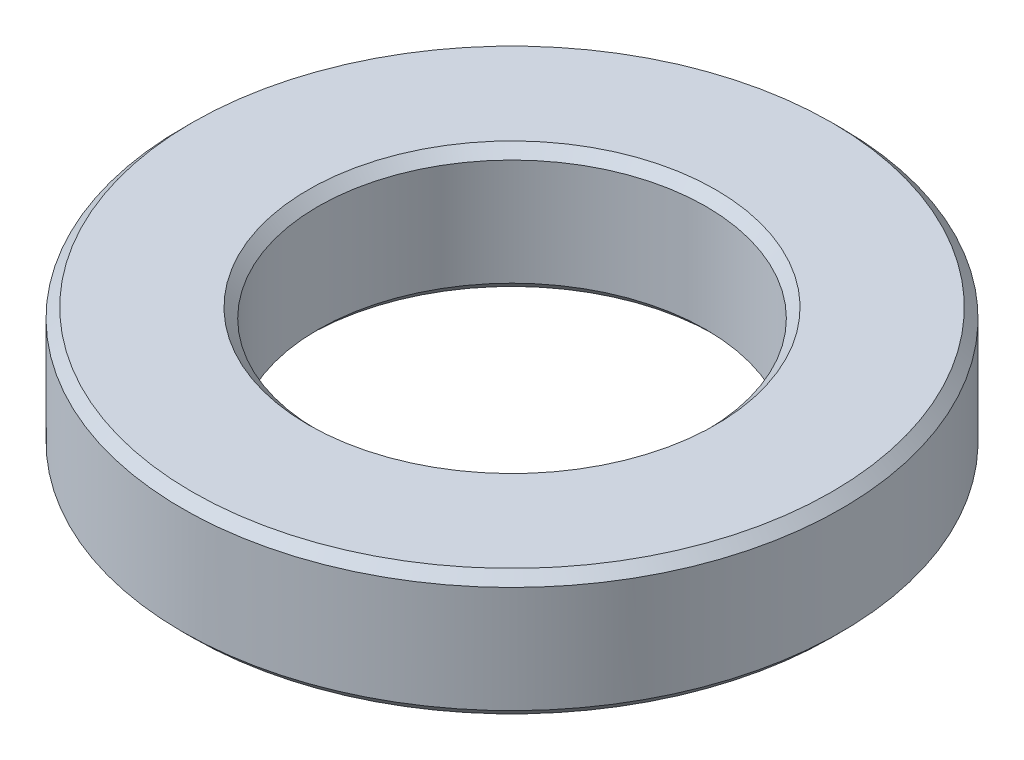
ISO-10303-21;
HEADER;
FILE_DESCRIPTION(('STEP AP214'),'2;1');
FILE_NAME('part.step','',(''),(''),'','','');
FILE_SCHEMA(('AUTOMOTIVE_DESIGN { 1 0 10303 214 1 1 1 1 }'));
ENDSEC;
DATA;
#1=APPLICATION_CONTEXT('core data for automotive mechanical design processes');
#2=APPLICATION_PROTOCOL_DEFINITION('international standard','automotive_design',2000,#1);
#3=PRODUCT_CONTEXT('',#1,'mechanical');
#4=PRODUCT('Part','Part','',(#3));
#5=PRODUCT_RELATED_PRODUCT_CATEGORY('part','',(#4));
#6=PRODUCT_DEFINITION_FORMATION('','',#4);
#7=PRODUCT_DEFINITION_CONTEXT('part definition',#1,'design');
#8=PRODUCT_DEFINITION('design','',#6,#7);
#9=PRODUCT_DEFINITION_SHAPE('','',#8);
#10=(LENGTH_UNIT() NAMED_UNIT(*) SI_UNIT(.MILLI.,.METRE.));
#11=(NAMED_UNIT(*) PLANE_ANGLE_UNIT() SI_UNIT($,.RADIAN.));
#12=(NAMED_UNIT(*) SI_UNIT($,.STERADIAN.) SOLID_ANGLE_UNIT());
#13=UNCERTAINTY_MEASURE_WITH_UNIT(LENGTH_MEASURE(1.E-05),#10,'distance_accuracy_value','');
#14=(GEOMETRIC_REPRESENTATION_CONTEXT(3) GLOBAL_UNCERTAINTY_ASSIGNED_CONTEXT((#13)) GLOBAL_UNIT_ASSIGNED_CONTEXT((#10,
#11,#12)) REPRESENTATION_CONTEXT('',''));
#15=CARTESIAN_POINT('',(0.,0.,0.));
#16=DIRECTION('',(0.,0.,1.));
#17=DIRECTION('',(1.,0.,0.));
#18=AXIS2_PLACEMENT_3D('',#15,#16,#17);
#19=CARTESIAN_POINT('',(0.,13.,0.));
#20=DIRECTION('',(0.,1.,0.));
#21=DIRECTION('',(0.,0.,1.));
#22=AXIS2_PLACEMENT_3D('',#19,#20,#21);
#23=PLANE('',#22);
#24=CARTESIAN_POINT('',(0.,13.,0.));
#25=DIRECTION('',(0.,1.,0.));
#26=DIRECTION('',(0.,0.,1.));
#27=AXIS2_PLACEMENT_3D('',#24,#25,#26);
#28=CIRCLE('',#27,32.99);
#29=CARTESIAN_POINT('',(0.,13.,32.99));
#30=VERTEX_POINT('',#29);
#31=EDGE_CURVE('E57',#30,#30,#28,.T.);
#32=ORIENTED_EDGE('',*,*,#31,.T.);
#33=EDGE_LOOP('',(#32));
#34=FACE_BOUND('',#33,.T.);
#35=CARTESIAN_POINT('',(0.,13.,0.));
#36=DIRECTION('',(0.,1.,0.));
#37=DIRECTION('',(0.,0.,1.));
#38=AXIS2_PLACEMENT_3D('',#35,#36,#37);
#39=CIRCLE('',#38,21.01);
#40=CARTESIAN_POINT('',(0.,13.,21.01));
#41=VERTEX_POINT('',#40);
#42=EDGE_CURVE('E62',#41,#41,#39,.F.);
#43=ORIENTED_EDGE('',*,*,#42,.T.);
#44=EDGE_LOOP('',(#43));
#45=FACE_BOUND('',#44,.T.);
#46=ADVANCED_FACE('F43',(#34,#45),#23,.T.);
#47=CARTESIAN_POINT('',(0.,0.,0.));
#48=DIRECTION('',(0.,1.,0.));
#49=DIRECTION('',(0.,0.,1.));
#50=AXIS2_PLACEMENT_3D('',#47,#48,#49);
#51=PLANE('',#50);
#52=CARTESIAN_POINT('',(0.,0.,0.));
#53=DIRECTION('',(0.,1.,0.));
#54=DIRECTION('',(0.,0.,1.));
#55=AXIS2_PLACEMENT_3D('',#52,#53,#54);
#56=CIRCLE('',#55,32.99);
#57=CARTESIAN_POINT('',(0.,0.,32.99));
#58=VERTEX_POINT('',#57);
#59=EDGE_CURVE('E68',#58,#58,#56,.F.);
#60=ORIENTED_EDGE('',*,*,#59,.T.);
#61=EDGE_LOOP('',(#60));
#62=FACE_BOUND('',#61,.T.);
#63=CARTESIAN_POINT('',(0.,0.,0.));
#64=DIRECTION('',(0.,1.,0.));
#65=DIRECTION('',(0.,0.,1.));
#66=AXIS2_PLACEMENT_3D('',#63,#64,#65);
#67=CIRCLE('',#66,21.01);
#68=CARTESIAN_POINT('',(0.,0.,21.01));
#69=VERTEX_POINT('',#68);
#70=EDGE_CURVE('E72',#69,#69,#67,.T.);
#71=ORIENTED_EDGE('',*,*,#70,.T.);
#72=EDGE_LOOP('',(#71));
#73=FACE_BOUND('',#72,.T.);
#74=ADVANCED_FACE('F97',(#62,#73),#51,.F.);
#75=CARTESIAN_POINT('',(0.,13.,0.));
#76=DIRECTION('',(0.,-1.,0.));
#77=DIRECTION('',(0.,0.,-1.));
#78=AXIS2_PLACEMENT_3D('',#75,#76,#77);
#79=CYLINDRICAL_SURFACE('',#78,33.99);
#80=CARTESIAN_POINT('',(0.,1.00000000000004,0.));
#81=DIRECTION('',(0.,1.,0.));
#82=DIRECTION('',(0.,0.,1.));
#83=AXIS2_PLACEMENT_3D('',#80,#81,#82);
#84=CIRCLE('',#83,33.99);
#85=CARTESIAN_POINT('',(0.,1.00000000000004,-33.99));
#86=VERTEX_POINT('',#85);
#87=EDGE_CURVE('E76',#86,#86,#84,.T.);
#88=CARTESIAN_POINT('',(0.,12.,0.));
#89=DIRECTION('',(0.,1.,0.));
#90=DIRECTION('',(0.,0.,1.));
#91=AXIS2_PLACEMENT_3D('',#88,#89,#90);
#92=CIRCLE('',#91,33.99);
#93=CARTESIAN_POINT('',(0.,12.,-33.99));
#94=VERTEX_POINT('',#93);
#95=EDGE_CURVE('E80',#94,#94,#92,.F.);
#96=CARTESIAN_POINT('',(0.,1.00000000000004,-33.99));
#97=CARTESIAN_POINT('',(0.,1.11458333333337,-33.99));
#98=CARTESIAN_POINT('',(0.,1.2291666666667,-33.99));
#99=CARTESIAN_POINT('',(0.,1.45833333333337,-33.99));
#100=CARTESIAN_POINT('',(0.,1.5729166666667,-33.99));
#101=CARTESIAN_POINT('',(0.,1.80208333333337,-33.99));
#102=CARTESIAN_POINT('',(0.,1.9166666666667,-33.99));
#103=CARTESIAN_POINT('',(0.,2.14583333333337,-33.99));
#104=CARTESIAN_POINT('',(0.,2.2604166666667,-33.99));
#105=CARTESIAN_POINT('',(0.,2.48958333333337,-33.99));
#106=CARTESIAN_POINT('',(0.,2.6041666666667,-33.99));
#107=CARTESIAN_POINT('',(0.,2.83333333333337,-33.99));
#108=CARTESIAN_POINT('',(0.,2.9479166666667,-33.99));
#109=CARTESIAN_POINT('',(0.,3.17708333333337,-33.99));
#110=CARTESIAN_POINT('',(0.,3.2916666666667,-33.99));
#111=CARTESIAN_POINT('',(0.,3.52083333333337,-33.99));
#112=CARTESIAN_POINT('',(0.,3.6354166666667,-33.99));
#113=CARTESIAN_POINT('',(0.,3.86458333333337,-33.99));
#114=CARTESIAN_POINT('',(0.,3.9791666666667,-33.99));
#115=CARTESIAN_POINT('',(0.,4.20833333333337,-33.99));
#116=CARTESIAN_POINT('',(0.,4.3229166666667,-33.99));
#117=CARTESIAN_POINT('',(0.,4.55208333333337,-33.99));
#118=CARTESIAN_POINT('',(0.,4.6666666666667,-33.99));
#119=CARTESIAN_POINT('',(0.,4.89583333333337,-33.99));
#120=CARTESIAN_POINT('',(0.,5.0104166666667,-33.99));
#121=CARTESIAN_POINT('',(0.,5.23958333333337,-33.99));
#122=CARTESIAN_POINT('',(0.,5.3541666666667,-33.99));
#123=CARTESIAN_POINT('',(0.,5.58333333333337,-33.99));
#124=CARTESIAN_POINT('',(0.,5.6979166666667,-33.99));
#125=CARTESIAN_POINT('',(0.,5.92708333333337,-33.99));
#126=CARTESIAN_POINT('',(0.,6.0416666666667,-33.99));
#127=CARTESIAN_POINT('',(0.,6.27083333333337,-33.99));
#128=CARTESIAN_POINT('',(0.,6.3854166666667,-33.99));
#129=CARTESIAN_POINT('',(0.,6.61458333333337,-33.99));
#130=CARTESIAN_POINT('',(0.,6.7291666666667,-33.99));
#131=CARTESIAN_POINT('',(0.,6.95833333333337,-33.99));
#132=CARTESIAN_POINT('',(0.,7.0729166666667,-33.99));
#133=CARTESIAN_POINT('',(0.,7.30208333333337,-33.99));
#134=CARTESIAN_POINT('',(0.,7.4166666666667,-33.99));
#135=CARTESIAN_POINT('',(0.,7.64583333333337,-33.99));
#136=CARTESIAN_POINT('',(0.,7.7604166666667,-33.99));
#137=CARTESIAN_POINT('',(0.,7.98958333333337,-33.99));
#138=CARTESIAN_POINT('',(0.,8.1041666666667,-33.99));
#139=CARTESIAN_POINT('',(0.,8.33333333333337,-33.99));
#140=CARTESIAN_POINT('',(0.,8.4479166666667,-33.99));
#141=CARTESIAN_POINT('',(0.,8.67708333333337,-33.99));
#142=CARTESIAN_POINT('',(0.,8.7916666666667,-33.99));
#143=CARTESIAN_POINT('',(0.,9.02083333333337,-33.99));
#144=CARTESIAN_POINT('',(0.,9.1354166666667,-33.99));
#145=CARTESIAN_POINT('',(0.,9.36458333333337,-33.99));
#146=CARTESIAN_POINT('',(0.,9.4791666666667,-33.99));
#147=CARTESIAN_POINT('',(0.,9.70833333333337,-33.99));
#148=CARTESIAN_POINT('',(0.,9.8229166666667,-33.99));
#149=CARTESIAN_POINT('',(0.,10.0520833333334,-33.99));
#150=CARTESIAN_POINT('',(0.,10.1666666666667,-33.99));
#151=CARTESIAN_POINT('',(0.,10.3958333333334,-33.99));
#152=CARTESIAN_POINT('',(0.,10.5104166666667,-33.99));
#153=CARTESIAN_POINT('',(0.,10.7395833333334,-33.99));
#154=CARTESIAN_POINT('',(0.,10.8541666666667,-33.99));
#155=CARTESIAN_POINT('',(0.,11.0833333333334,-33.99));
#156=CARTESIAN_POINT('',(0.,11.1979166666667,-33.99));
#157=CARTESIAN_POINT('',(0.,11.4270833333334,-33.99));
#158=CARTESIAN_POINT('',(0.,11.5416666666667,-33.99));
#159=CARTESIAN_POINT('',(0.,11.7708333333334,-33.99));
#160=CARTESIAN_POINT('',(0.,11.8854166666667,-33.99));
#161=CARTESIAN_POINT('',(0.,12.,-33.99));
#162=B_SPLINE_CURVE_WITH_KNOTS('',3,(#96,#97,#98,#99,#100,#101,#102,#103,#104,#105,#106,#107,
#108,#109,#110,#111,#112,#113,#114,#115,#116,#117,#118,#119,#120,#121,#122,#123,#124,#125,#126,
#127,#128,#129,#130,#131,#132,#133,#134,#135,#136,#137,#138,#139,#140,#141,#142,#143,#144,#145,
#146,#147,#148,#149,#150,#151,#152,#153,#154,#155,#156,#157,#158,#159,#160,#161),.UNSPECIFIED.,
.F.,.F.,(4,2,2,2,2,2,2,2,2,2,2,2,2,2,2,2,2,2,2,2,2,2,2,2,2,2,2,2,2,2,2,2,4),(0.,0.34375,
0.687500000000001,1.03125,1.375,1.71875,2.0625,2.40625,2.75,3.09375,3.4375,3.78125,4.125,
4.46875,4.8125,5.15625,5.5,5.84375,6.1875,6.53125,6.875,7.21875,7.5625,7.90625,8.25,8.59375,
8.9375,9.28125,9.625,9.96875,10.3125,10.65625,11.),.UNSPECIFIED.);
#163=EDGE_CURVE('BSEAM85',#86,#94,#162,.T.);
#164=ORIENTED_EDGE('',*,*,#87,.T.);
#165=ORIENTED_EDGE('',*,*,#95,.T.);
#166=ORIENTED_EDGE('',*,*,#163,.T.);
#167=ORIENTED_EDGE('',*,*,#163,.F.);
#168=EDGE_LOOP('',(#164,#166,#165,#167));
#169=FACE_BOUND('',#168,.T.);
#170=ADVANCED_FACE('F85',(#169),#79,.T.);
#171=CARTESIAN_POINT('',(0.,13.,0.));
#172=DIRECTION('',(0.,-1.,0.));
#173=DIRECTION('',(0.,0.,-1.));
#174=AXIS2_PLACEMENT_3D('',#171,#172,#173);
#175=CYLINDRICAL_SURFACE('',#174,20.01);
#176=CARTESIAN_POINT('',(0.,0.999999999999963,0.));
#177=DIRECTION('',(0.,1.,0.));
#178=DIRECTION('',(0.,0.,1.));
#179=AXIS2_PLACEMENT_3D('',#176,#177,#178);
#180=CIRCLE('',#179,20.01);
#181=CARTESIAN_POINT('',(0.,0.999999999999963,-20.01));
#182=VERTEX_POINT('',#181);
#183=EDGE_CURVE('E10',#182,#182,#180,.F.);
#184=CARTESIAN_POINT('',(0.,12.,0.));
#185=DIRECTION('',(0.,1.,0.));
#186=DIRECTION('',(0.,0.,1.));
#187=AXIS2_PLACEMENT_3D('',#184,#185,#186);
#188=CIRCLE('',#187,20.01);
#189=CARTESIAN_POINT('',(0.,12.,-20.01));
#190=VERTEX_POINT('',#189);
#191=EDGE_CURVE('E52',#190,#190,#188,.T.);
#192=CARTESIAN_POINT('',(0.,0.999999999999963,-20.01));
#193=CARTESIAN_POINT('',(0.,1.1145833333333,-20.01));
#194=CARTESIAN_POINT('',(0.,1.22916666666663,-20.01));
#195=CARTESIAN_POINT('',(0.,1.4583333333333,-20.01));
#196=CARTESIAN_POINT('',(0.,1.57291666666663,-20.01));
#197=CARTESIAN_POINT('',(0.,1.8020833333333,-20.01));
#198=CARTESIAN_POINT('',(0.,1.91666666666663,-20.01));
#199=CARTESIAN_POINT('',(0.,2.1458333333333,-20.01));
#200=CARTESIAN_POINT('',(0.,2.26041666666663,-20.01));
#201=CARTESIAN_POINT('',(0.,2.4895833333333,-20.01));
#202=CARTESIAN_POINT('',(0.,2.60416666666663,-20.01));
#203=CARTESIAN_POINT('',(0.,2.8333333333333,-20.01));
#204=CARTESIAN_POINT('',(0.,2.94791666666663,-20.01));
#205=CARTESIAN_POINT('',(0.,3.1770833333333,-20.01));
#206=CARTESIAN_POINT('',(0.,3.29166666666663,-20.01));
#207=CARTESIAN_POINT('',(0.,3.5208333333333,-20.01));
#208=CARTESIAN_POINT('',(0.,3.63541666666663,-20.01));
#209=CARTESIAN_POINT('',(0.,3.86458333333329,-20.01));
#210=CARTESIAN_POINT('',(0.,3.97916666666663,-20.01));
#211=CARTESIAN_POINT('',(0.,4.2083333333333,-20.01));
#212=CARTESIAN_POINT('',(0.,4.32291666666663,-20.01));
#213=CARTESIAN_POINT('',(0.,4.5520833333333,-20.01));
#214=CARTESIAN_POINT('',(0.,4.66666666666663,-20.01));
#215=CARTESIAN_POINT('',(0.,4.8958333333333,-20.01));
#216=CARTESIAN_POINT('',(0.,5.01041666666663,-20.01));
#217=CARTESIAN_POINT('',(0.,5.2395833333333,-20.01));
#218=CARTESIAN_POINT('',(0.,5.35416666666663,-20.01));
#219=CARTESIAN_POINT('',(0.,5.58333333333329,-20.01));
#220=CARTESIAN_POINT('',(0.,5.69791666666663,-20.01));
#221=CARTESIAN_POINT('',(0.,5.92708333333329,-20.01));
#222=CARTESIAN_POINT('',(0.,6.04166666666663,-20.01));
#223=CARTESIAN_POINT('',(0.,6.27083333333329,-20.01));
#224=CARTESIAN_POINT('',(0.,6.38541666666663,-20.01));
#225=CARTESIAN_POINT('',(0.,6.61458333333329,-20.01));
#226=CARTESIAN_POINT('',(0.,6.72916666666663,-20.01));
#227=CARTESIAN_POINT('',(0.,6.95833333333329,-20.01));
#228=CARTESIAN_POINT('',(0.,7.07291666666663,-20.01));
#229=CARTESIAN_POINT('',(0.,7.30208333333329,-20.01));
#230=CARTESIAN_POINT('',(0.,7.41666666666663,-20.01));
#231=CARTESIAN_POINT('',(0.,7.6458333333333,-20.01));
#232=CARTESIAN_POINT('',(0.,7.76041666666663,-20.01));
#233=CARTESIAN_POINT('',(0.,7.98958333333329,-20.01));
#234=CARTESIAN_POINT('',(0.,8.10416666666663,-20.01));
#235=CARTESIAN_POINT('',(0.,8.33333333333329,-20.01));
#236=CARTESIAN_POINT('',(0.,8.44791666666663,-20.01));
#237=CARTESIAN_POINT('',(0.,8.67708333333329,-20.01));
#238=CARTESIAN_POINT('',(0.,8.79166666666663,-20.01));
#239=CARTESIAN_POINT('',(0.,9.02083333333329,-20.01));
#240=CARTESIAN_POINT('',(0.,9.13541666666663,-20.01));
#241=CARTESIAN_POINT('',(0.,9.36458333333329,-20.01));
#242=CARTESIAN_POINT('',(0.,9.47916666666663,-20.01));
#243=CARTESIAN_POINT('',(0.,9.70833333333329,-20.01));
#244=CARTESIAN_POINT('',(0.,9.82291666666663,-20.01));
#245=CARTESIAN_POINT('',(0.,10.0520833333333,-20.01));
#246=CARTESIAN_POINT('',(0.,10.1666666666666,-20.01));
#247=CARTESIAN_POINT('',(0.,10.3958333333333,-20.01));
#248=CARTESIAN_POINT('',(0.,10.5104166666666,-20.01));
#249=CARTESIAN_POINT('',(0.,10.7395833333333,-20.01));
#250=CARTESIAN_POINT('',(0.,10.8541666666666,-20.01));
#251=CARTESIAN_POINT('',(0.,11.0833333333333,-20.01));
#252=CARTESIAN_POINT('',(0.,11.1979166666666,-20.01));
#253=CARTESIAN_POINT('',(0.,11.4270833333333,-20.01));
#254=CARTESIAN_POINT('',(0.,11.5416666666666,-20.01));
#255=CARTESIAN_POINT('',(0.,11.7708333333333,-20.01));
#256=CARTESIAN_POINT('',(0.,11.8854166666666,-20.01));
#257=CARTESIAN_POINT('',(0.,12.,-20.01));
#258=B_SPLINE_CURVE_WITH_KNOTS('',3,(#192,#193,#194,#195,#196,#197,#198,#199,#200,#201,#202,
#203,#204,#205,#206,#207,#208,#209,#210,#211,#212,#213,#214,#215,#216,#217,#218,#219,#220,#221,
#222,#223,#224,#225,#226,#227,#228,#229,#230,#231,#232,#233,#234,#235,#236,#237,#238,#239,#240,
#241,#242,#243,#244,#245,#246,#247,#248,#249,#250,#251,#252,#253,#254,#255,#256,#257),
.UNSPECIFIED.,.F.,.F.,(4,2,2,2,2,2,2,2,2,2,2,2,2,2,2,2,2,2,2,2,2,2,2,2,2,2,2,2,2,2,2,2,4),(0.,
0.34375,0.687500000000001,1.03125,1.375,1.71875,2.0625,2.40625,2.75,3.09375,3.4375,3.78125,
4.125,4.46875,4.8125,5.15625,5.5,5.84375,6.1875,6.53125,6.875,7.21875,7.5625,7.90625,8.25,
8.59375,8.9375,9.28125,9.625,9.96875,10.3125,10.65625,11.),.UNSPECIFIED.);
#259=EDGE_CURVE('BSEAM122',#182,#190,#258,.T.);
#260=ORIENTED_EDGE('',*,*,#183,.T.);
#261=ORIENTED_EDGE('',*,*,#191,.T.);
#262=ORIENTED_EDGE('',*,*,#259,.T.);
#263=ORIENTED_EDGE('',*,*,#259,.F.);
#264=EDGE_LOOP('',(#260,#262,#261,#263));
#265=FACE_BOUND('',#264,.T.);
#266=ADVANCED_FACE('F122',(#265),#175,.F.);
#267=CARTESIAN_POINT('',(0.,1.00000000000004,0.));
#268=DIRECTION('',(0.,1.,0.));
#269=DIRECTION('',(0.,0.,1.));
#270=AXIS2_PLACEMENT_3D('',#267,#268,#269);
#271=CONICAL_SURFACE('',#270,33.99,0.785398163397452);
#272=ORIENTED_EDGE('',*,*,#59,.F.);
#273=EDGE_LOOP('',(#272));
#274=FACE_BOUND('',#273,.T.);
#275=ORIENTED_EDGE('',*,*,#87,.F.);
#276=EDGE_LOOP('',(#275));
#277=FACE_BOUND('',#276,.T.);
#278=ADVANCED_FACE('F91',(#274,#277),#271,.T.);
#279=CARTESIAN_POINT('',(0.,13.,0.));
#280=DIRECTION('',(0.,-1.,0.));
#281=DIRECTION('',(0.,0.,-1.));
#282=AXIS2_PLACEMENT_3D('',#279,#280,#281);
#283=CONICAL_SURFACE('',#282,32.99,0.785398163397445);
#284=ORIENTED_EDGE('',*,*,#95,.F.);
#285=EDGE_LOOP('',(#284));
#286=FACE_BOUND('',#285,.T.);
#287=ORIENTED_EDGE('',*,*,#31,.F.);
#288=EDGE_LOOP('',(#287));
#289=FACE_BOUND('',#288,.T.);
#290=ADVANCED_FACE('F87',(#286,#289),#283,.T.);
#291=CARTESIAN_POINT('',(0.,0.,0.));
#292=DIRECTION('',(0.,-1.,0.));
#293=DIRECTION('',(0.,0.,-1.));
#294=AXIS2_PLACEMENT_3D('',#291,#292,#293);
#295=CONICAL_SURFACE('',#294,21.01,0.785398163397448);
#296=ORIENTED_EDGE('',*,*,#183,.F.);
#297=EDGE_LOOP('',(#296));
#298=FACE_BOUND('',#297,.T.);
#299=ORIENTED_EDGE('',*,*,#70,.F.);
#300=EDGE_LOOP('',(#299));
#301=FACE_BOUND('',#300,.T.);
#302=ADVANCED_FACE('F90',(#298,#301),#295,.F.);
#303=CARTESIAN_POINT('',(0.,12.,0.));
#304=DIRECTION('',(0.,1.,0.));
#305=DIRECTION('',(0.,0.,1.));
#306=AXIS2_PLACEMENT_3D('',#303,#304,#305);
#307=CONICAL_SURFACE('',#306,20.01,0.785398163397448);
#308=ORIENTED_EDGE('',*,*,#42,.F.);
#309=EDGE_LOOP('',(#308));
#310=FACE_BOUND('',#309,.T.);
#311=ORIENTED_EDGE('',*,*,#191,.F.);
#312=EDGE_LOOP('',(#311));
#313=FACE_BOUND('',#312,.T.);
#314=ADVANCED_FACE('F46',(#310,#313),#307,.F.);
#315=CLOSED_SHELL('',(#46,#74,#170,#266,#278,#290,#302,#314));
#316=MANIFOLD_SOLID_BREP('B2',#315);
#317=ADVANCED_BREP_SHAPE_REPRESENTATION('',(#18,#316),#14);
#318=SHAPE_DEFINITION_REPRESENTATION(#9,#317);
ENDSEC;
END-ISO-10303-21;
